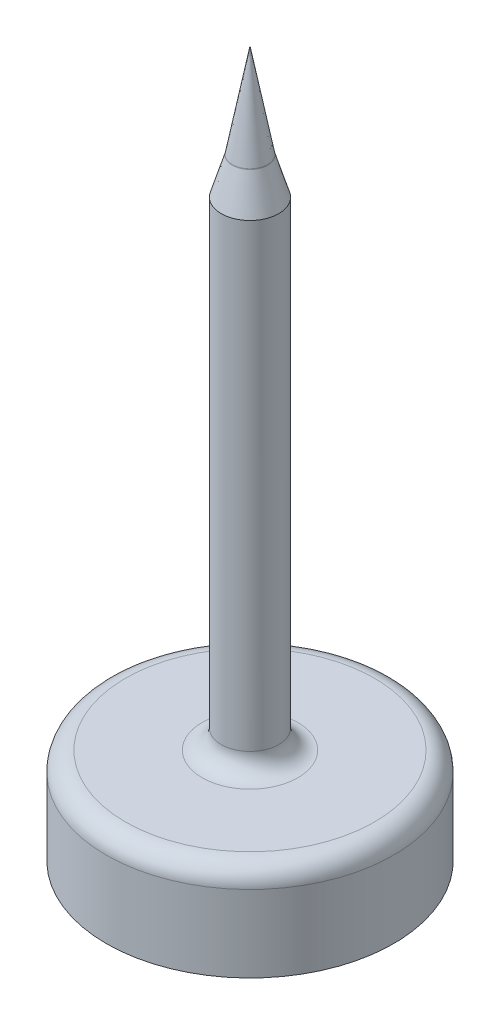
ISO-10303-21;
HEADER;
FILE_DESCRIPTION(('STEP AP214'),'2;1');
FILE_NAME('part.step','',(''),(''),'','','');
FILE_SCHEMA(('AUTOMOTIVE_DESIGN { 1 0 10303 214 1 1 1 1 }'));
ENDSEC;
DATA;
#1=APPLICATION_CONTEXT('core data for automotive mechanical design processes');
#2=APPLICATION_PROTOCOL_DEFINITION('international standard','automotive_design',2000,#1);
#3=PRODUCT_CONTEXT('',#1,'mechanical');
#4=PRODUCT('Part','Part','',(#3));
#5=PRODUCT_RELATED_PRODUCT_CATEGORY('part','',(#4));
#6=PRODUCT_DEFINITION_FORMATION('','',#4);
#7=PRODUCT_DEFINITION_CONTEXT('part definition',#1,'design');
#8=PRODUCT_DEFINITION('design','',#6,#7);
#9=PRODUCT_DEFINITION_SHAPE('','',#8);
#10=(LENGTH_UNIT() NAMED_UNIT(*) SI_UNIT(.MILLI.,.METRE.));
#11=(NAMED_UNIT(*) PLANE_ANGLE_UNIT() SI_UNIT($,.RADIAN.));
#12=(NAMED_UNIT(*) SI_UNIT($,.STERADIAN.) SOLID_ANGLE_UNIT());
#13=UNCERTAINTY_MEASURE_WITH_UNIT(LENGTH_MEASURE(1.E-05),#10,'distance_accuracy_value','');
#14=(GEOMETRIC_REPRESENTATION_CONTEXT(3) GLOBAL_UNCERTAINTY_ASSIGNED_CONTEXT((#13)) GLOBAL_UNIT_ASSIGNED_CONTEXT((#10,
#11,#12)) REPRESENTATION_CONTEXT('',''));
#15=CARTESIAN_POINT('',(0.,0.,0.));
#16=DIRECTION('',(0.,0.,1.));
#17=DIRECTION('',(1.,0.,0.));
#18=AXIS2_PLACEMENT_3D('',#15,#16,#17);
#19=CARTESIAN_POINT('',(0.,0.,0.));
#20=DIRECTION('',(0.,-1.,0.));
#21=DIRECTION('',(0.,0.,-1.));
#22=AXIS2_PLACEMENT_3D('',#19,#20,#21);
#23=PLANE('',#22);
#24=CARTESIAN_POINT('',(0.,0.,0.));
#25=DIRECTION('',(0.,-1.,0.));
#26=DIRECTION('',(0.,0.,-1.));
#27=AXIS2_PLACEMENT_3D('',#24,#25,#26);
#28=CIRCLE('',#27,15.);
#29=CARTESIAN_POINT('',(0.,0.,-15.));
#30=VERTEX_POINT('',#29);
#31=EDGE_CURVE('E100',#30,#30,#28,.T.);
#32=ORIENTED_EDGE('',*,*,#31,.T.);
#33=EDGE_LOOP('',(#32));
#34=FACE_BOUND('',#33,.T.);
#35=ADVANCED_FACE('F33',(#34),#23,.T.);
#36=CARTESIAN_POINT('',(0.,0.,0.));
#37=DIRECTION('',(0.,-1.,0.));
#38=DIRECTION('',(0.,0.,-1.));
#39=AXIS2_PLACEMENT_3D('',#36,#37,#38);
#40=CYLINDRICAL_SURFACE('',#39,15.);
#41=CARTESIAN_POINT('',(0.,8.,0.));
#42=DIRECTION('',(0.,1.,0.));
#43=DIRECTION('',(0.,0.,1.));
#44=AXIS2_PLACEMENT_3D('',#41,#42,#43);
#45=CIRCLE('',#44,15.);
#46=CARTESIAN_POINT('',(0.,8.,15.));
#47=VERTEX_POINT('',#46);
#48=EDGE_CURVE('E89',#47,#47,#45,.F.);
#49=ORIENTED_EDGE('',*,*,#48,.T.);
#50=EDGE_LOOP('',(#49));
#51=FACE_BOUND('',#50,.T.);
#52=ORIENTED_EDGE('',*,*,#31,.F.);
#53=EDGE_LOOP('',(#52));
#54=FACE_BOUND('',#53,.T.);
#55=ADVANCED_FACE('F60',(#51,#54),#40,.T.);
#56=CARTESIAN_POINT('',(0.,10.,-15.));
#57=DIRECTION('',(0.,1.,0.));
#58=DIRECTION('',(0.,0.,1.));
#59=AXIS2_PLACEMENT_3D('',#56,#57,#58);
#60=PLANE('',#59);
#61=CARTESIAN_POINT('',(0.,10.,0.));
#62=DIRECTION('',(0.,1.,0.));
#63=DIRECTION('',(0.,0.,1.));
#64=AXIS2_PLACEMENT_3D('',#61,#62,#63);
#65=CIRCLE('',#64,5.);
#66=CARTESIAN_POINT('',(0.,10.,5.));
#67=VERTEX_POINT('',#66);
#68=EDGE_CURVE('E83',#67,#67,#65,.F.);
#69=ORIENTED_EDGE('',*,*,#68,.T.);
#70=EDGE_LOOP('',(#69));
#71=FACE_BOUND('',#70,.T.);
#72=CARTESIAN_POINT('',(0.,10.,0.));
#73=DIRECTION('',(0.,1.,0.));
#74=DIRECTION('',(0.,0.,1.));
#75=AXIS2_PLACEMENT_3D('',#72,#73,#74);
#76=CIRCLE('',#75,13.);
#77=CARTESIAN_POINT('',(0.,10.,13.));
#78=VERTEX_POINT('',#77);
#79=EDGE_CURVE('E85',#78,#78,#76,.T.);
#80=ORIENTED_EDGE('',*,*,#79,.T.);
#81=EDGE_LOOP('',(#80));
#82=FACE_BOUND('',#81,.T.);
#83=ADVANCED_FACE('F66',(#71,#82),#60,.T.);
#84=CARTESIAN_POINT('',(0.,0.,0.));
#85=DIRECTION('',(0.,-1.,0.));
#86=DIRECTION('',(0.,0.,-1.));
#87=AXIS2_PLACEMENT_3D('',#84,#85,#86);
#88=CYLINDRICAL_SURFACE('',#87,3.);
#89=CARTESIAN_POINT('',(0.,12.,0.));
#90=DIRECTION('',(0.,1.,0.));
#91=DIRECTION('',(0.,0.,1.));
#92=AXIS2_PLACEMENT_3D('',#89,#90,#91);
#93=CIRCLE('',#92,3.);
#94=CARTESIAN_POINT('',(0.,12.,3.));
#95=VERTEX_POINT('',#94);
#96=EDGE_CURVE('E80',#95,#95,#93,.T.);
#97=ORIENTED_EDGE('',*,*,#96,.T.);
#98=EDGE_LOOP('',(#97));
#99=FACE_BOUND('',#98,.T.);
#100=CARTESIAN_POINT('',(0.,60.,0.));
#101=DIRECTION('',(0.,-1.,0.));
#102=DIRECTION('',(0.,0.,-1.));
#103=AXIS2_PLACEMENT_3D('',#100,#101,#102);
#104=CIRCLE('',#103,3.);
#105=CARTESIAN_POINT('',(0.,60.,-3.));
#106=VERTEX_POINT('',#105);
#107=EDGE_CURVE('E98',#106,#106,#104,.T.);
#108=ORIENTED_EDGE('',*,*,#107,.T.);
#109=EDGE_LOOP('',(#108));
#110=FACE_BOUND('',#109,.T.);
#111=ADVANCED_FACE('F56',(#99,#110),#88,.T.);
#112=CARTESIAN_POINT('',(0.,60.,0.));
#113=DIRECTION('',(0.,-1.,0.));
#114=DIRECTION('',(0.,0.,-1.));
#115=AXIS2_PLACEMENT_3D('',#112,#113,#114);
#116=CONICAL_SURFACE('',#115,3.,0.292444333894408);
#117=CARTESIAN_POINT('',(0.,63.804602590575,0.));
#118=DIRECTION('',(0.,-1.,0.));
#119=DIRECTION('',(0.,0.,-1.));
#120=AXIS2_PLACEMENT_3D('',#117,#118,#119);
#121=CIRCLE('',#120,1.8545226652677);
#122=CARTESIAN_POINT('',(0.,63.804602590575,-1.8545226652677));
#123=VERTEX_POINT('',#122);
#124=EDGE_CURVE('E40',#123,#123,#121,.T.);
#125=ORIENTED_EDGE('',*,*,#124,.T.);
#126=EDGE_LOOP('',(#125));
#127=FACE_BOUND('',#126,.T.);
#128=ORIENTED_EDGE('',*,*,#107,.F.);
#129=EDGE_LOOP('',(#128));
#130=FACE_BOUND('',#129,.T.);
#131=ADVANCED_FACE('F46',(#127,#130),#116,.T.);
#132=CARTESIAN_POINT('',(0.,63.8301682034065,0.));
#133=DIRECTION('',(0.,-1.,0.));
#134=DIRECTION('',(0.,0.,-1.));
#135=AXIS2_PLACEMENT_3D('',#132,#133,#134);
#136=CONICAL_SURFACE('',#135,1.84682545396904,0.185748841557577);
#137=CARTESIAN_POINT('',(0.,63.8564081361304,0.));
#138=DIRECTION('',(0.,-1.,0.));
#139=DIRECTION('',(0.,0.,-1.));
#140=AXIS2_PLACEMENT_3D('',#137,#138,#139);
#141=CIRCLE('',#140,1.84189457657503);
#142=CARTESIAN_POINT('',(0.,63.8564081361304,-1.84189457657503));
#143=VERTEX_POINT('',#142);
#144=EDGE_CURVE('E11',#143,#143,#141,.F.);
#145=ORIENTED_EDGE('',*,*,#144,.T.);
#146=EDGE_LOOP('',(#145));
#147=FACE_BOUND('',#146,.T.);
#148=CARTESIAN_POINT('',(0.,73.6581504857762,0.));
#149=VERTEX_POINT('',#148);
#150=VERTEX_LOOP('',#149);
#151=FACE_BOUND('',#150,.T.);
#152=ADVANCED_FACE('F43',(#147,#151),#136,.T.);
#153=CARTESIAN_POINT('',(0.,8.,0.));
#154=DIRECTION('',(0.,1.,0.));
#155=DIRECTION('',(0.,0.,1.));
#156=AXIS2_PLACEMENT_3D('',#153,#154,#155);
#157=TOROIDAL_SURFACE('',#156,13.,2.);
#158=ORIENTED_EDGE('',*,*,#79,.F.);
#159=EDGE_LOOP('',(#158));
#160=FACE_BOUND('',#159,.T.);
#161=ORIENTED_EDGE('',*,*,#48,.F.);
#162=EDGE_LOOP('',(#161));
#163=FACE_BOUND('',#162,.T.);
#164=ADVANCED_FACE('F45',(#160,#163),#157,.T.);
#165=CARTESIAN_POINT('',(0.,12.,0.));
#166=DIRECTION('',(0.,1.,0.));
#167=DIRECTION('',(0.,0.,1.));
#168=AXIS2_PLACEMENT_3D('',#165,#166,#167);
#169=TOROIDAL_SURFACE('',#168,5.,2.);
#170=ORIENTED_EDGE('',*,*,#96,.F.);
#171=EDGE_LOOP('',(#170));
#172=FACE_BOUND('',#171,.T.);
#173=ORIENTED_EDGE('',*,*,#68,.F.);
#174=EDGE_LOOP('',(#173));
#175=FACE_BOUND('',#174,.T.);
#176=ADVANCED_FACE('F53',(#172,#175),#169,.F.);
#177=CARTESIAN_POINT('',(0.,63.9487494088288,0.));
#178=DIRECTION('',(0.,-1.,0.));
#179=DIRECTION('',(0.,0.,-1.));
#180=AXIS2_PLACEMENT_3D('',#177,#178,#179);
#181=TOROIDAL_SURFACE('',#180,2.33329369069352,0.5);
#182=ORIENTED_EDGE('',*,*,#144,.F.);
#183=EDGE_LOOP('',(#182));
#184=FACE_BOUND('',#183,.T.);
#185=ORIENTED_EDGE('',*,*,#124,.F.);
#186=EDGE_LOOP('',(#185));
#187=FACE_BOUND('',#186,.T.);
#188=ADVANCED_FACE('F35',(#184,#187),#181,.F.);
#189=CLOSED_SHELL('',(#35,#55,#83,#111,#131,#152,#164,#176,#188));
#190=MANIFOLD_SOLID_BREP('B2',#189);
#191=ADVANCED_BREP_SHAPE_REPRESENTATION('',(#18,#190),#14);
#192=SHAPE_DEFINITION_REPRESENTATION(#9,#191);
ENDSEC;
END-ISO-10303-21;
